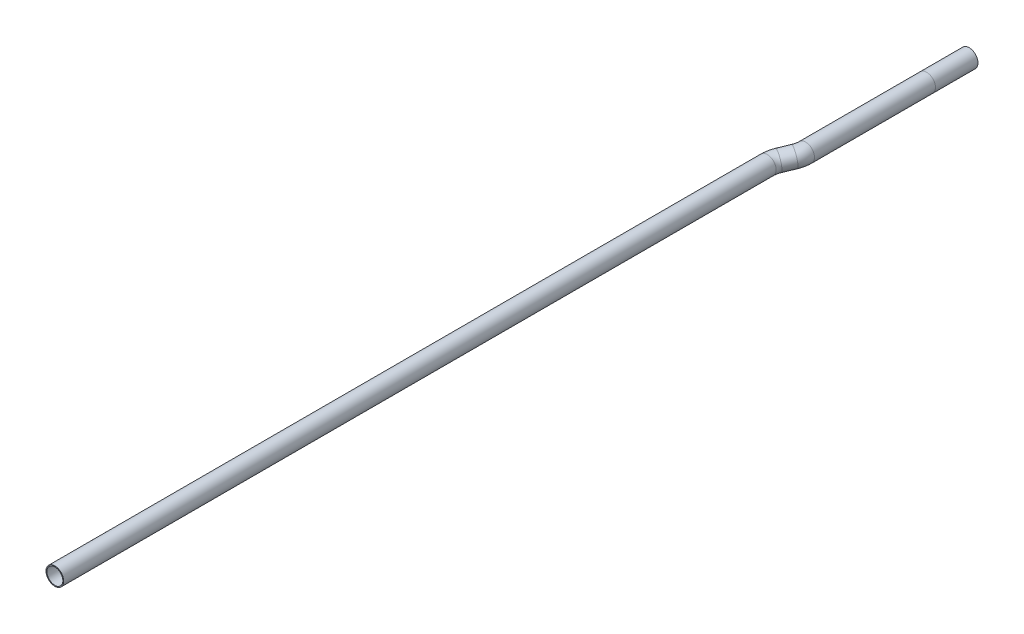
ISO-10303-21;
HEADER;
FILE_DESCRIPTION(('STEP AP214'),'2;1');
FILE_NAME('part.step','',(''),(''),'','','');
FILE_SCHEMA(('AUTOMOTIVE_DESIGN { 1 0 10303 214 1 1 1 1 }'));
ENDSEC;
DATA;
#1=APPLICATION_CONTEXT('core data for automotive mechanical design processes');
#2=APPLICATION_PROTOCOL_DEFINITION('international standard','automotive_design',2000,#1);
#3=PRODUCT_CONTEXT('',#1,'mechanical');
#4=PRODUCT('Part','Part','',(#3));
#5=PRODUCT_RELATED_PRODUCT_CATEGORY('part','',(#4));
#6=PRODUCT_DEFINITION_FORMATION('','',#4);
#7=PRODUCT_DEFINITION_CONTEXT('part definition',#1,'design');
#8=PRODUCT_DEFINITION('design','',#6,#7);
#9=PRODUCT_DEFINITION_SHAPE('','',#8);
#10=(LENGTH_UNIT() NAMED_UNIT(*) SI_UNIT(.MILLI.,.METRE.));
#11=(NAMED_UNIT(*) PLANE_ANGLE_UNIT() SI_UNIT($,.RADIAN.));
#12=(NAMED_UNIT(*) SI_UNIT($,.STERADIAN.) SOLID_ANGLE_UNIT());
#13=UNCERTAINTY_MEASURE_WITH_UNIT(LENGTH_MEASURE(1.E-05),#10,'distance_accuracy_value','');
#14=(GEOMETRIC_REPRESENTATION_CONTEXT(3) GLOBAL_UNCERTAINTY_ASSIGNED_CONTEXT((#13)) GLOBAL_UNIT_ASSIGNED_CONTEXT((#10,
#11,#12)) REPRESENTATION_CONTEXT('',''));
#15=CARTESIAN_POINT('',(0.,0.,0.));
#16=DIRECTION('',(0.,0.,1.));
#17=DIRECTION('',(1.,0.,0.));
#18=AXIS2_PLACEMENT_3D('',#15,#16,#17);
#19=CARTESIAN_POINT('',(0.,0.,311.15));
#20=DIRECTION('',(0.,0.,-1.));
#21=DIRECTION('',(-1.,0.,0.));
#22=AXIS2_PLACEMENT_3D('',#19,#20,#21);
#23=CYLINDRICAL_SURFACE('',#22,3.175);
#24=CARTESIAN_POINT('',(0.,0.,55.88));
#25=DIRECTION('',(0.,0.,1.));
#26=DIRECTION('',(1.,0.,0.));
#27=AXIS2_PLACEMENT_3D('',#24,#25,#26);
#28=CIRCLE('',#27,3.175);
#29=CARTESIAN_POINT('',(-3.11399326528026,-0.619411772401213,55.88));
#30=VERTEX_POINT('',#29);
#31=EDGE_CURVE('E55',#30,#30,#28,.T.);
#32=ORIENTED_EDGE('',*,*,#31,.T.);
#33=EDGE_LOOP('',(#32));
#34=FACE_BOUND('',#33,.T.);
#35=CARTESIAN_POINT('',(0.,0.,311.15));
#36=DIRECTION('',(0.,0.,1.));
#37=DIRECTION('',(1.,0.,0.));
#38=AXIS2_PLACEMENT_3D('',#35,#36,#37);
#39=CIRCLE('',#38,3.175);
#40=CARTESIAN_POINT('',(3.175,0.,311.15));
#41=VERTEX_POINT('',#40);
#42=EDGE_CURVE('E52',#41,#41,#39,.T.);
#43=ORIENTED_EDGE('',*,*,#42,.F.);
#44=EDGE_LOOP('',(#43));
#45=FACE_BOUND('',#44,.T.);
#46=ADVANCED_FACE('F31',(#34,#45),#23,.T.);
#47=CARTESIAN_POINT('',(6.22798653056051,1.23882354480242,55.88));
#48=DIRECTION('',(0.195090322016129,-0.98078528040323,0.));
#49=DIRECTION('',(0.98078528040323,0.195090322016129,0.));
#50=AXIS2_PLACEMENT_3D('',#47,#48,#49);
#51=TOROIDAL_SURFACE('',#50,6.35000000000001,3.175);
#52=CARTESIAN_POINT('',(0.8343919806678,0.165970884197233,52.705));
#53=DIRECTION('',(-0.490392640201617,-0.0975451610080649,0.866025403784438));
#54=DIRECTION('',(0.871124508232208,-0.0256349291647492,0.490392640201617));
#55=AXIS2_PLACEMENT_3D('',#52,#53,#54);
#56=CIRCLE('',#55,3.175);
#57=CARTESIAN_POINT('',(-1.86240529427855,-0.37045544610536,51.1175));
#58=VERTEX_POINT('',#57);
#59=EDGE_CURVE('E58',#58,#58,#56,.T.);
#60=CARTESIAN_POINT('',(6.22798653056051,1.23882354480242,55.88));
#61=DIRECTION('',(0.195090322016129,-0.98078528040323,0.));
#62=DIRECTION('',(0.98078528040323,0.195090322016129,0.));
#63=AXIS2_PLACEMENT_3D('',#60,#61,#62);
#64=CIRCLE('',#63,9.52500000000001);
#65=EDGE_CURVE('',#30,#58,#64,.T.);
#66=ORIENTED_EDGE('',*,*,#31,.F.);
#67=ORIENTED_EDGE('',*,*,#59,.T.);
#68=ORIENTED_EDGE('',*,*,#65,.T.);
#69=ORIENTED_EDGE('',*,*,#65,.F.);
#70=EDGE_LOOP('',(#66,#68,#67,#69));
#71=FACE_BOUND('',#70,.T.);
#72=ADVANCED_FACE('F103',(#71),#51,.T.);
#73=CARTESIAN_POINT('',(0.834391980667797,0.165970884197232,52.705));
#74=DIRECTION('',(0.490392640201617,0.0975451610080649,-0.866025403784437));
#75=DIRECTION('',(-0.870175182581317,0.,-0.492742480023361));
#76=AXIS2_PLACEMENT_3D('',#73,#74,#75);
#77=CYLINDRICAL_SURFACE('',#76,3.175);
#78=CARTESIAN_POINT('',(2.9023999376685,0.577323242684214,49.0529316792873));
#79=DIRECTION('',(-0.490392640201617,-0.097545161008065,0.866025403784437));
#80=DIRECTION('',(0.871124508232208,-0.0256349291647494,0.490392640201617));
#81=AXIS2_PLACEMENT_3D('',#78,#79,#80);
#82=CIRCLE('',#81,3.175);
#83=CARTESIAN_POINT('',(5.59919721261486,1.11374957298681,50.6404316792873));
#84=VERTEX_POINT('',#83);
#85=EDGE_CURVE('E61',#84,#84,#82,.T.);
#86=ORIENTED_EDGE('',*,*,#85,.T.);
#87=EDGE_LOOP('',(#86));
#88=FACE_BOUND('',#87,.T.);
#89=ORIENTED_EDGE('',*,*,#59,.F.);
#90=EDGE_LOOP('',(#89));
#91=FACE_BOUND('',#90,.T.);
#92=ADVANCED_FACE('F107',(#88,#91),#77,.T.);
#93=CARTESIAN_POINT('',(-2.49119461222421,-0.49552941792097,45.8779316792873));
#94=DIRECTION('',(-0.195090322016129,0.98078528040323,0.));
#95=DIRECTION('',(-0.98078528040323,-0.195090322016129,0.));
#96=AXIS2_PLACEMENT_3D('',#93,#94,#95);
#97=TOROIDAL_SURFACE('',#96,6.35,3.175);
#98=CARTESIAN_POINT('',(3.73679191833631,0.74329412688145,45.8779316792873));
#99=DIRECTION('',(0.,0.,1.));
#100=DIRECTION('',(1.,0.,0.));
#101=AXIS2_PLACEMENT_3D('',#98,#99,#100);
#102=CIRCLE('',#101,3.175);
#103=CARTESIAN_POINT('',(6.85078518361656,1.36270589928266,45.8779316792873));
#104=VERTEX_POINT('',#103);
#105=EDGE_CURVE('E63',#104,#104,#102,.T.);
#106=CARTESIAN_POINT('',(-2.49119461222421,-0.49552941792097,45.8779316792873));
#107=DIRECTION('',(-0.195090322016129,0.98078528040323,0.));
#108=DIRECTION('',(-0.98078528040323,-0.195090322016129,0.));
#109=AXIS2_PLACEMENT_3D('',#106,#107,#108);
#110=CIRCLE('',#109,9.525);
#111=EDGE_CURVE('',#84,#104,#110,.T.);
#112=ORIENTED_EDGE('',*,*,#85,.F.);
#113=ORIENTED_EDGE('',*,*,#105,.T.);
#114=ORIENTED_EDGE('',*,*,#111,.T.);
#115=ORIENTED_EDGE('',*,*,#111,.F.);
#116=EDGE_LOOP('',(#112,#114,#113,#115));
#117=FACE_BOUND('',#116,.T.);
#118=ADVANCED_FACE('F83',(#117),#97,.T.);
#119=CARTESIAN_POINT('',(3.73679191833631,0.74329412688145,45.8779316792873));
#120=DIRECTION('',(0.,0.,-1.));
#121=DIRECTION('',(-1.,0.,0.));
#122=AXIS2_PLACEMENT_3D('',#119,#120,#121);
#123=CYLINDRICAL_SURFACE('',#122,3.175);
#124=CARTESIAN_POINT('',(3.73679191833631,0.74329412688145,2.54));
#125=DIRECTION('',(0.,0.,1.));
#126=DIRECTION('',(1.,0.,0.));
#127=AXIS2_PLACEMENT_3D('',#124,#125,#126);
#128=CIRCLE('',#127,3.175);
#129=CARTESIAN_POINT('',(6.91179191833631,0.74329412688145,2.54));
#130=VERTEX_POINT('',#129);
#131=EDGE_CURVE('E35',#130,#130,#128,.T.);
#132=ORIENTED_EDGE('',*,*,#131,.T.);
#133=EDGE_LOOP('',(#132));
#134=FACE_BOUND('',#133,.T.);
#135=ORIENTED_EDGE('',*,*,#105,.F.);
#136=EDGE_LOOP('',(#135));
#137=FACE_BOUND('',#136,.T.);
#138=ADVANCED_FACE('F70',(#134,#137),#123,.T.);
#139=CARTESIAN_POINT('',(3.73679191833631,0.74329412688145,2.54));
#140=DIRECTION('',(0.,0.,-1.));
#141=DIRECTION('',(-1.,0.,0.));
#142=AXIS2_PLACEMENT_3D('',#139,#140,#141);
#143=CYLINDRICAL_SURFACE('',#142,3.175);
#144=CARTESIAN_POINT('',(3.7367919183363,0.74329412688145,-12.7));
#145=DIRECTION('',(0.,0.,1.));
#146=DIRECTION('',(1.,0.,0.));
#147=AXIS2_PLACEMENT_3D('',#144,#145,#146);
#148=CIRCLE('',#147,3.175);
#149=CARTESIAN_POINT('',(6.9117919183363,0.74329412688145,-12.7));
#150=VERTEX_POINT('',#149);
#151=EDGE_CURVE('E48',#150,#150,#148,.T.);
#152=ORIENTED_EDGE('',*,*,#151,.T.);
#153=EDGE_LOOP('',(#152));
#154=FACE_BOUND('',#153,.T.);
#155=ORIENTED_EDGE('',*,*,#131,.F.);
#156=EDGE_LOOP('',(#155));
#157=FACE_BOUND('',#156,.T.);
#158=ADVANCED_FACE('F33',(#154,#157),#143,.T.);
#159=CARTESIAN_POINT('',(0.,0.,311.15));
#160=DIRECTION('',(0.,0.,1.));
#161=DIRECTION('',(1.,0.,0.));
#162=AXIS2_PLACEMENT_3D('',#159,#160,#161);
#163=PLANE('',#162);
#164=CARTESIAN_POINT('',(0.,0.,311.15));
#165=DIRECTION('',(0.,0.,1.));
#166=DIRECTION('',(1.,0.,0.));
#167=AXIS2_PLACEMENT_3D('',#164,#165,#166);
#168=CIRCLE('',#167,2.8575);
#169=CARTESIAN_POINT('',(2.8575,0.,311.15));
#170=VERTEX_POINT('',#169);
#171=EDGE_CURVE('E51',#170,#170,#168,.F.);
#172=ORIENTED_EDGE('',*,*,#171,.T.);
#173=EDGE_LOOP('',(#172));
#174=FACE_BOUND('',#173,.T.);
#175=ORIENTED_EDGE('',*,*,#42,.T.);
#176=EDGE_LOOP('',(#175));
#177=FACE_BOUND('',#176,.T.);
#178=ADVANCED_FACE('F74',(#174,#177),#163,.T.);
#179=CARTESIAN_POINT('',(3.7367919183363,0.74329412688145,-12.7));
#180=DIRECTION('',(0.,0.,1.));
#181=DIRECTION('',(1.,0.,0.));
#182=AXIS2_PLACEMENT_3D('',#179,#180,#181);
#183=PLANE('',#182);
#184=CARTESIAN_POINT('',(3.7367919183363,0.74329412688145,-12.7));
#185=DIRECTION('',(0.,0.,1.));
#186=DIRECTION('',(1.,0.,0.));
#187=AXIS2_PLACEMENT_3D('',#184,#185,#186);
#188=CIRCLE('',#187,2.8575);
#189=CARTESIAN_POINT('',(6.5942919183363,0.74329412688145,-12.7));
#190=VERTEX_POINT('',#189);
#191=EDGE_CURVE('E10',#190,#190,#188,.F.);
#192=ORIENTED_EDGE('',*,*,#191,.F.);
#193=EDGE_LOOP('',(#192));
#194=FACE_BOUND('',#193,.T.);
#195=ORIENTED_EDGE('',*,*,#151,.F.);
#196=EDGE_LOOP('',(#195));
#197=FACE_BOUND('',#196,.T.);
#198=ADVANCED_FACE('F80',(#194,#197),#183,.F.);
#199=CARTESIAN_POINT('',(0.,0.,311.15));
#200=DIRECTION('',(0.,0.,-1.));
#201=DIRECTION('',(-1.,0.,0.));
#202=AXIS2_PLACEMENT_3D('',#199,#200,#201);
#203=CYLINDRICAL_SURFACE('',#202,2.8575);
#204=CARTESIAN_POINT('',(0.,0.,55.88));
#205=DIRECTION('',(0.,0.,1.));
#206=DIRECTION('',(1.,0.,0.));
#207=AXIS2_PLACEMENT_3D('',#204,#205,#206);
#208=CIRCLE('',#207,2.8575);
#209=CARTESIAN_POINT('',(-2.80259393875223,-0.557470595161092,55.88));
#210=VERTEX_POINT('',#209);
#211=EDGE_CURVE('E206',#210,#210,#208,.F.);
#212=ORIENTED_EDGE('',*,*,#211,.T.);
#213=EDGE_LOOP('',(#212));
#214=FACE_BOUND('',#213,.T.);
#215=ORIENTED_EDGE('',*,*,#171,.F.);
#216=EDGE_LOOP('',(#215));
#217=FACE_BOUND('',#216,.T.);
#218=ADVANCED_FACE('F98',(#214,#217),#203,.F.);
#219=CARTESIAN_POINT('',(6.22798653056051,1.23882354480242,55.88));
#220=DIRECTION('',(0.195090322016129,-0.98078528040323,0.));
#221=DIRECTION('',(0.98078528040323,0.195090322016129,0.));
#222=AXIS2_PLACEMENT_3D('',#219,#220,#221);
#223=TOROIDAL_SURFACE('',#222,6.35000000000001,2.8575);
#224=CARTESIAN_POINT('',(0.8343919806678,0.165970884197233,52.705));
#225=DIRECTION('',(-0.490392640201617,-0.0975451610080649,0.866025403784438));
#226=DIRECTION('',(0.871124508232208,-0.0256349291647492,0.490392640201617));
#227=AXIS2_PLACEMENT_3D('',#224,#225,#226);
#228=CIRCLE('',#227,2.8575);
#229=CARTESIAN_POINT('',(-1.59272556678392,-0.3168128130751,51.27625));
#230=VERTEX_POINT('',#229);
#231=EDGE_CURVE('E203',#230,#230,#228,.F.);
#232=CARTESIAN_POINT('',(6.22798653056051,1.23882354480242,55.88));
#233=DIRECTION('',(0.195090322016129,-0.98078528040323,0.));
#234=DIRECTION('',(0.98078528040323,0.195090322016129,0.));
#235=AXIS2_PLACEMENT_3D('',#232,#233,#234);
#236=CIRCLE('',#235,9.2075);
#237=EDGE_CURVE('',#210,#230,#236,.T.);
#238=ORIENTED_EDGE('',*,*,#211,.F.);
#239=ORIENTED_EDGE('',*,*,#231,.T.);
#240=ORIENTED_EDGE('',*,*,#237,.T.);
#241=ORIENTED_EDGE('',*,*,#237,.F.);
#242=EDGE_LOOP('',(#238,#240,#239,#241));
#243=FACE_BOUND('',#242,.T.);
#244=ADVANCED_FACE('F155',(#243),#223,.F.);
#245=CARTESIAN_POINT('',(0.834391980667797,0.165970884197232,52.705));
#246=DIRECTION('',(0.490392640201617,0.0975451610080649,-0.866025403784437));
#247=DIRECTION('',(-0.870175182581317,0.,-0.492742480023361));
#248=AXIS2_PLACEMENT_3D('',#245,#246,#247);
#249=CYLINDRICAL_SURFACE('',#248,2.8575);
#250=CARTESIAN_POINT('',(2.9023999376685,0.577323242684214,49.0529316792873));
#251=DIRECTION('',(-0.490392640201617,-0.097545161008065,0.866025403784437));
#252=DIRECTION('',(0.871124508232208,-0.0256349291647494,0.490392640201617));
#253=AXIS2_PLACEMENT_3D('',#250,#251,#252);
#254=CIRCLE('',#253,2.8575);
#255=CARTESIAN_POINT('',(5.32951748512022,1.06010693995655,50.4816816792873));
#256=VERTEX_POINT('',#255);
#257=EDGE_CURVE('E202',#256,#256,#254,.F.);
#258=ORIENTED_EDGE('',*,*,#257,.T.);
#259=EDGE_LOOP('',(#258));
#260=FACE_BOUND('',#259,.T.);
#261=ORIENTED_EDGE('',*,*,#231,.F.);
#262=EDGE_LOOP('',(#261));
#263=FACE_BOUND('',#262,.T.);
#264=ADVANCED_FACE('F165',(#260,#263),#249,.F.);
#265=CARTESIAN_POINT('',(-2.49119461222421,-0.49552941792097,45.8779316792873));
#266=DIRECTION('',(-0.195090322016129,0.98078528040323,0.));
#267=DIRECTION('',(-0.98078528040323,-0.195090322016129,0.));
#268=AXIS2_PLACEMENT_3D('',#265,#266,#267);
#269=TOROIDAL_SURFACE('',#268,6.35,2.8575);
#270=CARTESIAN_POINT('',(3.73679191833631,0.74329412688145,45.8779316792873));
#271=DIRECTION('',(0.,0.,1.));
#272=DIRECTION('',(1.,0.,0.));
#273=AXIS2_PLACEMENT_3D('',#270,#271,#272);
#274=CIRCLE('',#273,2.8575);
#275=CARTESIAN_POINT('',(6.53938585708854,1.30076472204254,45.8779316792873));
#276=VERTEX_POINT('',#275);
#277=EDGE_CURVE('E44',#276,#276,#274,.F.);
#278=CARTESIAN_POINT('',(-2.49119461222421,-0.49552941792097,45.8779316792873));
#279=DIRECTION('',(-0.195090322016129,0.98078528040323,0.));
#280=DIRECTION('',(-0.98078528040323,-0.195090322016129,0.));
#281=AXIS2_PLACEMENT_3D('',#278,#279,#280);
#282=CIRCLE('',#281,9.2075);
#283=EDGE_CURVE('',#256,#276,#282,.T.);
#284=ORIENTED_EDGE('',*,*,#257,.F.);
#285=ORIENTED_EDGE('',*,*,#277,.T.);
#286=ORIENTED_EDGE('',*,*,#283,.T.);
#287=ORIENTED_EDGE('',*,*,#283,.F.);
#288=EDGE_LOOP('',(#284,#286,#285,#287));
#289=FACE_BOUND('',#288,.T.);
#290=ADVANCED_FACE('F91',(#289),#269,.F.);
#291=CARTESIAN_POINT('',(3.73679191833631,0.74329412688145,45.8779316792873));
#292=DIRECTION('',(0.,0.,-1.));
#293=DIRECTION('',(-1.,0.,0.));
#294=AXIS2_PLACEMENT_3D('',#291,#292,#293);
#295=CYLINDRICAL_SURFACE('',#294,2.8575);
#296=CARTESIAN_POINT('',(3.73679191833631,0.74329412688145,2.54));
#297=DIRECTION('',(0.,0.,1.));
#298=DIRECTION('',(1.,0.,0.));
#299=AXIS2_PLACEMENT_3D('',#296,#297,#298);
#300=CIRCLE('',#299,2.8575);
#301=CARTESIAN_POINT('',(6.5942919183363,0.74329412688145,2.54));
#302=VERTEX_POINT('',#301);
#303=EDGE_CURVE('E39',#302,#302,#300,.F.);
#304=ORIENTED_EDGE('',*,*,#303,.T.);
#305=EDGE_LOOP('',(#304));
#306=FACE_BOUND('',#305,.T.);
#307=ORIENTED_EDGE('',*,*,#277,.F.);
#308=EDGE_LOOP('',(#307));
#309=FACE_BOUND('',#308,.T.);
#310=ADVANCED_FACE('F86',(#306,#309),#295,.F.);
#311=CARTESIAN_POINT('',(3.73679191833631,0.74329412688145,2.54));
#312=DIRECTION('',(0.,0.,-1.));
#313=DIRECTION('',(-1.,0.,0.));
#314=AXIS2_PLACEMENT_3D('',#311,#312,#313);
#315=CYLINDRICAL_SURFACE('',#314,2.8575);
#316=ORIENTED_EDGE('',*,*,#191,.T.);
#317=EDGE_LOOP('',(#316));
#318=FACE_BOUND('',#317,.T.);
#319=ORIENTED_EDGE('',*,*,#303,.F.);
#320=EDGE_LOOP('',(#319));
#321=FACE_BOUND('',#320,.T.);
#322=ADVANCED_FACE('F84',(#318,#321),#315,.F.);
#323=CLOSED_SHELL('',(#46,#72,#92,#118,#138,#158,#178,#198,#218,#244,#264,#290,#310,#322));
#324=MANIFOLD_SOLID_BREP('B2',#323);
#325=ADVANCED_BREP_SHAPE_REPRESENTATION('',(#18,#324),#14);
#326=SHAPE_DEFINITION_REPRESENTATION(#9,#325);
ENDSEC;
END-ISO-10303-21;
